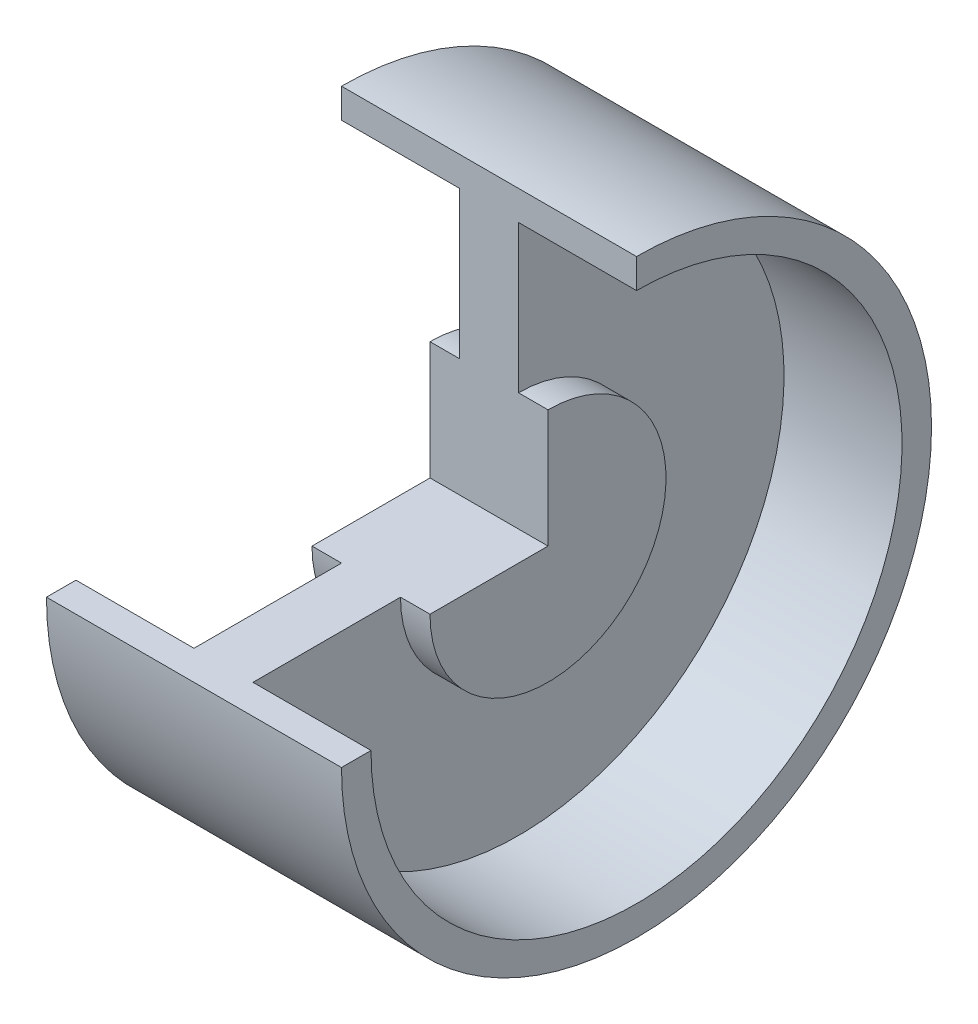
ISO-10303-21;
HEADER;
FILE_DESCRIPTION(('STEP AP214'),'2;1');
FILE_NAME('part.step','',(''),(''),'','','');
FILE_SCHEMA(('AUTOMOTIVE_DESIGN { 1 0 10303 214 1 1 1 1 }'));
ENDSEC;
DATA;
#1=APPLICATION_CONTEXT('core data for automotive mechanical design processes');
#2=APPLICATION_PROTOCOL_DEFINITION('international standard','automotive_design',2000,#1);
#3=PRODUCT_CONTEXT('',#1,'mechanical');
#4=PRODUCT('Part','Part','',(#3));
#5=PRODUCT_RELATED_PRODUCT_CATEGORY('part','',(#4));
#6=PRODUCT_DEFINITION_FORMATION('','',#4);
#7=PRODUCT_DEFINITION_CONTEXT('part definition',#1,'design');
#8=PRODUCT_DEFINITION('design','',#6,#7);
#9=PRODUCT_DEFINITION_SHAPE('','',#8);
#10=(LENGTH_UNIT() NAMED_UNIT(*) SI_UNIT(.MILLI.,.METRE.));
#11=(NAMED_UNIT(*) PLANE_ANGLE_UNIT() SI_UNIT($,.RADIAN.));
#12=(NAMED_UNIT(*) SI_UNIT($,.STERADIAN.) SOLID_ANGLE_UNIT());
#13=UNCERTAINTY_MEASURE_WITH_UNIT(LENGTH_MEASURE(1.E-05),#10,'distance_accuracy_value','');
#14=(GEOMETRIC_REPRESENTATION_CONTEXT(3) GLOBAL_UNCERTAINTY_ASSIGNED_CONTEXT((#13)) GLOBAL_UNIT_ASSIGNED_CONTEXT((#10,
#11,#12)) REPRESENTATION_CONTEXT('',''));
#15=CARTESIAN_POINT('',(0.,0.,0.));
#16=DIRECTION('',(0.,0.,1.));
#17=DIRECTION('',(1.,0.,0.));
#18=AXIS2_PLACEMENT_3D('',#15,#16,#17);
#19=CARTESIAN_POINT('',(0.,0.,0.));
#20=DIRECTION('',(0.,0.,1.));
#21=DIRECTION('',(1.,0.,0.));
#22=AXIS2_PLACEMENT_3D('',#19,#20,#21);
#23=PLANE('',#22);
#24=DIRECTION('',(1.,0.,0.));
#25=VECTOR('',#24,1.);
#26=CARTESIAN_POINT('',(0.,50.,0.));
#27=LINE('',#26,#25);
#28=CARTESIAN_POINT('',(-25.,50.,0.));
#29=VERTEX_POINT('',#28);
#30=CARTESIAN_POINT('',(25.,50.,0.));
#31=VERTEX_POINT('',#30);
#32=EDGE_CURVE('E205',#29,#31,#27,.T.);
#33=ORIENTED_EDGE('',*,*,#32,.F.);
#34=DIRECTION('',(0.,1.,0.));
#35=VECTOR('',#34,1.);
#36=CARTESIAN_POINT('',(-25.,45.,0.));
#37=LINE('',#36,#35);
#38=CARTESIAN_POINT('',(-25.,45.,0.));
#39=VERTEX_POINT('',#38);
#40=EDGE_CURVE('E162',#39,#29,#37,.T.);
#41=ORIENTED_EDGE('',*,*,#40,.F.);
#42=DIRECTION('',(-1.,0.,0.));
#43=VECTOR('',#42,1.);
#44=CARTESIAN_POINT('',(-5.,45.,0.));
#45=LINE('',#44,#43);
#46=CARTESIAN_POINT('',(-5.,45.,0.));
#47=VERTEX_POINT('',#46);
#48=EDGE_CURVE('E166',#47,#39,#45,.T.);
#49=ORIENTED_EDGE('',*,*,#48,.F.);
#50=DIRECTION('',(0.,1.,0.));
#51=VECTOR('',#50,1.);
#52=CARTESIAN_POINT('',(-5.,20.,0.));
#53=LINE('',#52,#51);
#54=CARTESIAN_POINT('',(-5.,20.,0.));
#55=VERTEX_POINT('',#54);
#56=EDGE_CURVE('E173',#55,#47,#53,.T.);
#57=ORIENTED_EDGE('',*,*,#56,.F.);
#58=DIRECTION('',(1.,0.,0.));
#59=VECTOR('',#58,1.);
#60=CARTESIAN_POINT('',(-10.,20.,0.));
#61=LINE('',#60,#59);
#62=CARTESIAN_POINT('',(-10.,20.,0.));
#63=VERTEX_POINT('',#62);
#64=EDGE_CURVE('E174',#63,#55,#61,.T.);
#65=ORIENTED_EDGE('',*,*,#64,.F.);
#66=DIRECTION('',(0.,1.,0.));
#67=VECTOR('',#66,1.);
#68=CARTESIAN_POINT('',(-10.,0.,0.));
#69=LINE('',#68,#67);
#70=CARTESIAN_POINT('',(-10.,0.,0.));
#71=VERTEX_POINT('',#70);
#72=EDGE_CURVE('E180',#71,#63,#69,.T.);
#73=ORIENTED_EDGE('',*,*,#72,.F.);
#74=DIRECTION('',(-1.,0.,0.));
#75=VECTOR('',#74,1.);
#76=CARTESIAN_POINT('',(0.,0.,0.));
#77=LINE('',#76,#75);
#78=CARTESIAN_POINT('',(10.,0.,0.));
#79=VERTEX_POINT('',#78);
#80=EDGE_CURVE('E103',#79,#71,#77,.T.);
#81=ORIENTED_EDGE('',*,*,#80,.F.);
#82=DIRECTION('',(0.,1.,0.));
#83=VECTOR('',#82,1.);
#84=CARTESIAN_POINT('',(10.,0.,0.));
#85=LINE('',#84,#83);
#86=CARTESIAN_POINT('',(10.,20.,0.));
#87=VERTEX_POINT('',#86);
#88=EDGE_CURVE('E204',#79,#87,#85,.T.);
#89=ORIENTED_EDGE('',*,*,#88,.T.);
#90=DIRECTION('',(-1.,0.,0.));
#91=VECTOR('',#90,1.);
#92=CARTESIAN_POINT('',(0.,20.,0.));
#93=LINE('',#92,#91);
#94=CARTESIAN_POINT('',(5.,20.,0.));
#95=VERTEX_POINT('',#94);
#96=EDGE_CURVE('E210',#87,#95,#93,.T.);
#97=ORIENTED_EDGE('',*,*,#96,.T.);
#98=DIRECTION('',(0.,1.,0.));
#99=VECTOR('',#98,1.);
#100=CARTESIAN_POINT('',(5.,0.,0.));
#101=LINE('',#100,#99);
#102=CARTESIAN_POINT('',(5.,45.,0.));
#103=VERTEX_POINT('',#102);
#104=EDGE_CURVE('E212',#95,#103,#101,.T.);
#105=ORIENTED_EDGE('',*,*,#104,.T.);
#106=DIRECTION('',(1.,0.,0.));
#107=VECTOR('',#106,1.);
#108=CARTESIAN_POINT('',(0.,45.,0.));
#109=LINE('',#108,#107);
#110=CARTESIAN_POINT('',(25.,45.,0.));
#111=VERTEX_POINT('',#110);
#112=EDGE_CURVE('E145',#103,#111,#109,.T.);
#113=ORIENTED_EDGE('',*,*,#112,.T.);
#114=DIRECTION('',(0.,1.,0.));
#115=VECTOR('',#114,1.);
#116=CARTESIAN_POINT('',(25.,0.,0.));
#117=LINE('',#116,#115);
#118=EDGE_CURVE('E214',#111,#31,#117,.T.);
#119=ORIENTED_EDGE('',*,*,#118,.T.);
#120=EDGE_LOOP('',(#33,#41,#49,#57,#65,#73,#81,#89,#97,#105,#113,#119));
#121=FACE_BOUND('',#120,.T.);
#122=ADVANCED_FACE('F41',(#121),#23,.T.);
#123=CARTESIAN_POINT('',(0.,0.,0.));
#124=DIRECTION('',(0.,-1.,0.));
#125=DIRECTION('',(1.,0.,0.));
#126=AXIS2_PLACEMENT_3D('',#123,#124,#125);
#127=PLANE('',#126);
#128=DIRECTION('',(1.,0.,0.));
#129=VECTOR('',#128,1.);
#130=CARTESIAN_POINT('',(0.,5.22497554027323E-13,50.));
#131=LINE('',#130,#129);
#132=CARTESIAN_POINT('',(-25.,5.22497554027323E-13,50.));
#133=VERTEX_POINT('',#132);
#134=CARTESIAN_POINT('',(25.,5.22497554027323E-13,50.));
#135=VERTEX_POINT('',#134);
#136=EDGE_CURVE('E220',#133,#135,#131,.T.);
#137=ORIENTED_EDGE('',*,*,#136,.T.);
#138=DIRECTION('',(0.,0.,1.));
#139=VECTOR('',#138,1.);
#140=CARTESIAN_POINT('',(25.,0.,0.));
#141=LINE('',#140,#139);
#142=CARTESIAN_POINT('',(25.,4.70125333944676E-13,45.));
#143=VERTEX_POINT('',#142);
#144=EDGE_CURVE('E160',#143,#135,#141,.T.);
#145=ORIENTED_EDGE('',*,*,#144,.F.);
#146=DIRECTION('',(1.,0.,0.));
#147=VECTOR('',#146,1.);
#148=CARTESIAN_POINT('',(0.,4.70125333944676E-13,45.));
#149=LINE('',#148,#147);
#150=CARTESIAN_POINT('',(5.,4.70125333944676E-13,45.));
#151=VERTEX_POINT('',#150);
#152=EDGE_CURVE('E137',#151,#143,#149,.T.);
#153=ORIENTED_EDGE('',*,*,#152,.F.);
#154=DIRECTION('',(0.,0.,1.));
#155=VECTOR('',#154,1.);
#156=CARTESIAN_POINT('',(5.,0.,0.));
#157=LINE('',#156,#155);
#158=CARTESIAN_POINT('',(5.,2.08264233531441E-13,20.));
#159=VERTEX_POINT('',#158);
#160=EDGE_CURVE('E146',#159,#151,#157,.T.);
#161=ORIENTED_EDGE('',*,*,#160,.F.);
#162=DIRECTION('',(-1.,0.,0.));
#163=VECTOR('',#162,1.);
#164=CARTESIAN_POINT('',(0.,2.08264233531441E-13,20.));
#165=LINE('',#164,#163);
#166=CARTESIAN_POINT('',(10.,2.08264233531441E-13,20.));
#167=VERTEX_POINT('',#166);
#168=EDGE_CURVE('E151',#167,#159,#165,.T.);
#169=ORIENTED_EDGE('',*,*,#168,.F.);
#170=DIRECTION('',(0.,0.,1.));
#171=VECTOR('',#170,1.);
#172=CARTESIAN_POINT('',(10.,0.,0.));
#173=LINE('',#172,#171);
#174=EDGE_CURVE('E217',#79,#167,#173,.T.);
#175=ORIENTED_EDGE('',*,*,#174,.F.);
#176=ORIENTED_EDGE('',*,*,#80,.T.);
#177=DIRECTION('',(0.,0.,1.));
#178=VECTOR('',#177,1.);
#179=CARTESIAN_POINT('',(-10.,0.,0.));
#180=LINE('',#179,#178);
#181=CARTESIAN_POINT('',(-10.,2.08264233531441E-13,20.));
#182=VERTEX_POINT('',#181);
#183=EDGE_CURVE('E192',#71,#182,#180,.T.);
#184=ORIENTED_EDGE('',*,*,#183,.T.);
#185=DIRECTION('',(1.,0.,0.));
#186=VECTOR('',#185,1.);
#187=CARTESIAN_POINT('',(-10.,2.08264233531441E-13,20.));
#188=LINE('',#187,#186);
#189=CARTESIAN_POINT('',(-5.,2.08264233531441E-13,20.));
#190=VERTEX_POINT('',#189);
#191=EDGE_CURVE('E187',#182,#190,#188,.T.);
#192=ORIENTED_EDGE('',*,*,#191,.T.);
#193=DIRECTION('',(0.,0.,1.));
#194=VECTOR('',#193,1.);
#195=CARTESIAN_POINT('',(-5.,2.08264233531441E-13,20.));
#196=LINE('',#195,#194);
#197=CARTESIAN_POINT('',(-5.,4.70125333944676E-13,45.));
#198=VERTEX_POINT('',#197);
#199=EDGE_CURVE('E184',#190,#198,#196,.T.);
#200=ORIENTED_EDGE('',*,*,#199,.T.);
#201=DIRECTION('',(-1.,0.,0.));
#202=VECTOR('',#201,1.);
#203=CARTESIAN_POINT('',(-5.,4.70125333944676E-13,45.));
#204=LINE('',#203,#202);
#205=CARTESIAN_POINT('',(-25.,4.70125333944676E-13,45.));
#206=VERTEX_POINT('',#205);
#207=EDGE_CURVE('E185',#198,#206,#204,.T.);
#208=ORIENTED_EDGE('',*,*,#207,.T.);
#209=DIRECTION('',(0.,0.,1.));
#210=VECTOR('',#209,1.);
#211=CARTESIAN_POINT('',(-25.,4.70125333944676E-13,45.));
#212=LINE('',#211,#210);
#213=EDGE_CURVE('E177',#206,#133,#212,.T.);
#214=ORIENTED_EDGE('',*,*,#213,.T.);
#215=EDGE_LOOP('',(#137,#145,#153,#161,#169,#175,#176,#184,#192,#200,#208,#214));
#216=FACE_BOUND('',#215,.T.);
#217=ADVANCED_FACE('F152',(#216),#127,.F.);
#218=CARTESIAN_POINT('',(10.,0.,0.));
#219=DIRECTION('',(1.,0.,0.));
#220=DIRECTION('',(0.,0.,-1.));
#221=AXIS2_PLACEMENT_3D('',#218,#219,#220);
#222=CYLINDRICAL_SURFACE('',#221,50.);
#223=ORIENTED_EDGE('',*,*,#136,.F.);
#224=CARTESIAN_POINT('',(-25.,0.,0.));
#225=DIRECTION('',(1.,0.,0.));
#226=DIRECTION('',(0.,0.,-1.));
#227=AXIS2_PLACEMENT_3D('',#224,#225,#226);
#228=CIRCLE('',#227,50.);
#229=EDGE_CURVE('E44',#133,#29,#228,.T.);
#230=ORIENTED_EDGE('',*,*,#229,.T.);
#231=ORIENTED_EDGE('',*,*,#32,.T.);
#232=CARTESIAN_POINT('',(25.,0.,0.));
#233=DIRECTION('',(1.,0.,0.));
#234=DIRECTION('',(0.,0.,-1.));
#235=AXIS2_PLACEMENT_3D('',#232,#233,#234);
#236=CIRCLE('',#235,50.);
#237=EDGE_CURVE('E58',#135,#31,#236,.T.);
#238=ORIENTED_EDGE('',*,*,#237,.F.);
#239=EDGE_LOOP('',(#223,#230,#231,#238));
#240=FACE_BOUND('',#239,.T.);
#241=ADVANCED_FACE('F245',(#240),#222,.T.);
#242=CARTESIAN_POINT('',(25.,0.,0.));
#243=DIRECTION('',(1.,0.,0.));
#244=DIRECTION('',(0.,0.,-1.));
#245=AXIS2_PLACEMENT_3D('',#242,#243,#244);
#246=PLANE('',#245);
#247=ORIENTED_EDGE('',*,*,#144,.T.);
#248=ORIENTED_EDGE('',*,*,#237,.T.);
#249=ORIENTED_EDGE('',*,*,#118,.F.);
#250=CARTESIAN_POINT('',(25.,0.,0.));
#251=DIRECTION('',(1.,0.,0.));
#252=DIRECTION('',(0.,0.,-1.));
#253=AXIS2_PLACEMENT_3D('',#250,#251,#252);
#254=CIRCLE('',#253,45.);
#255=EDGE_CURVE('E147',#143,#111,#254,.T.);
#256=ORIENTED_EDGE('',*,*,#255,.F.);
#257=EDGE_LOOP('',(#247,#248,#249,#256));
#258=FACE_BOUND('',#257,.T.);
#259=ADVANCED_FACE('F238',(#258),#246,.T.);
#260=CARTESIAN_POINT('',(10.,0.,0.));
#261=DIRECTION('',(1.,0.,0.));
#262=DIRECTION('',(0.,0.,-1.));
#263=AXIS2_PLACEMENT_3D('',#260,#261,#262);
#264=CYLINDRICAL_SURFACE('',#263,45.);
#265=ORIENTED_EDGE('',*,*,#255,.T.);
#266=ORIENTED_EDGE('',*,*,#112,.F.);
#267=CARTESIAN_POINT('',(5.,0.,0.));
#268=DIRECTION('',(1.,0.,0.));
#269=DIRECTION('',(0.,0.,-1.));
#270=AXIS2_PLACEMENT_3D('',#267,#268,#269);
#271=CIRCLE('',#270,45.);
#272=EDGE_CURVE('E134',#151,#103,#271,.T.);
#273=ORIENTED_EDGE('',*,*,#272,.F.);
#274=ORIENTED_EDGE('',*,*,#152,.T.);
#275=EDGE_LOOP('',(#265,#266,#273,#274));
#276=FACE_BOUND('',#275,.T.);
#277=ADVANCED_FACE('F140',(#276),#264,.F.);
#278=CARTESIAN_POINT('',(5.,0.,0.));
#279=DIRECTION('',(1.,0.,0.));
#280=DIRECTION('',(0.,0.,-1.));
#281=AXIS2_PLACEMENT_3D('',#278,#279,#280);
#282=PLANE('',#281);
#283=ORIENTED_EDGE('',*,*,#272,.T.);
#284=ORIENTED_EDGE('',*,*,#104,.F.);
#285=CARTESIAN_POINT('',(5.,0.,0.));
#286=DIRECTION('',(1.,0.,0.));
#287=DIRECTION('',(0.,0.,-1.));
#288=AXIS2_PLACEMENT_3D('',#285,#286,#287);
#289=CIRCLE('',#288,20.);
#290=EDGE_CURVE('E51',#159,#95,#289,.T.);
#291=ORIENTED_EDGE('',*,*,#290,.F.);
#292=ORIENTED_EDGE('',*,*,#160,.T.);
#293=EDGE_LOOP('',(#283,#284,#291,#292));
#294=FACE_BOUND('',#293,.T.);
#295=ADVANCED_FACE('F148',(#294),#282,.T.);
#296=CARTESIAN_POINT('',(10.,0.,0.));
#297=DIRECTION('',(1.,0.,0.));
#298=DIRECTION('',(0.,0.,-1.));
#299=AXIS2_PLACEMENT_3D('',#296,#297,#298);
#300=CYLINDRICAL_SURFACE('',#299,20.);
#301=ORIENTED_EDGE('',*,*,#290,.T.);
#302=ORIENTED_EDGE('',*,*,#96,.F.);
#303=CARTESIAN_POINT('',(10.,0.,0.));
#304=DIRECTION('',(1.,0.,0.));
#305=DIRECTION('',(0.,0.,-1.));
#306=AXIS2_PLACEMENT_3D('',#303,#304,#305);
#307=CIRCLE('',#306,20.);
#308=EDGE_CURVE('E11',#167,#87,#307,.T.);
#309=ORIENTED_EDGE('',*,*,#308,.F.);
#310=ORIENTED_EDGE('',*,*,#168,.T.);
#311=EDGE_LOOP('',(#301,#302,#309,#310));
#312=FACE_BOUND('',#311,.T.);
#313=ADVANCED_FACE('F225',(#312),#300,.T.);
#314=CARTESIAN_POINT('',(10.,0.,0.));
#315=DIRECTION('',(1.,0.,0.));
#316=DIRECTION('',(0.,0.,-1.));
#317=AXIS2_PLACEMENT_3D('',#314,#315,#316);
#318=PLANE('',#317);
#319=ORIENTED_EDGE('',*,*,#308,.T.);
#320=ORIENTED_EDGE('',*,*,#88,.F.);
#321=ORIENTED_EDGE('',*,*,#174,.T.);
#322=EDGE_LOOP('',(#319,#320,#321));
#323=FACE_BOUND('',#322,.T.);
#324=ADVANCED_FACE('F222',(#323),#318,.T.);
#325=CARTESIAN_POINT('',(-10.,0.,0.));
#326=DIRECTION('',(1.,0.,0.));
#327=DIRECTION('',(0.,0.,-1.));
#328=AXIS2_PLACEMENT_3D('',#325,#326,#327);
#329=PLANE('',#328);
#330=ORIENTED_EDGE('',*,*,#72,.T.);
#331=CARTESIAN_POINT('',(-10.,0.,0.));
#332=DIRECTION('',(1.,0.,0.));
#333=DIRECTION('',(0.,0.,-1.));
#334=AXIS2_PLACEMENT_3D('',#331,#332,#333);
#335=CIRCLE('',#334,20.);
#336=EDGE_CURVE('E100',#182,#63,#335,.T.);
#337=ORIENTED_EDGE('',*,*,#336,.F.);
#338=ORIENTED_EDGE('',*,*,#183,.F.);
#339=EDGE_LOOP('',(#330,#337,#338));
#340=FACE_BOUND('',#339,.T.);
#341=ADVANCED_FACE('F228',(#340),#329,.F.);
#342=CARTESIAN_POINT('',(10.,0.,0.));
#343=DIRECTION('',(1.,0.,0.));
#344=DIRECTION('',(0.,0.,-1.));
#345=AXIS2_PLACEMENT_3D('',#342,#343,#344);
#346=CYLINDRICAL_SURFACE('',#345,20.);
#347=ORIENTED_EDGE('',*,*,#336,.T.);
#348=ORIENTED_EDGE('',*,*,#64,.T.);
#349=CARTESIAN_POINT('',(-5.,0.,0.));
#350=DIRECTION('',(1.,0.,0.));
#351=DIRECTION('',(0.,0.,-1.));
#352=AXIS2_PLACEMENT_3D('',#349,#350,#351);
#353=CIRCLE('',#352,20.);
#354=EDGE_CURVE('E191',#190,#55,#353,.T.);
#355=ORIENTED_EDGE('',*,*,#354,.F.);
#356=ORIENTED_EDGE('',*,*,#191,.F.);
#357=EDGE_LOOP('',(#347,#348,#355,#356));
#358=FACE_BOUND('',#357,.T.);
#359=ADVANCED_FACE('F231',(#358),#346,.T.);
#360=CARTESIAN_POINT('',(-5.,2.08264233531441E-13,20.));
#361=DIRECTION('',(1.,0.,0.));
#362=DIRECTION('',(0.,0.,-1.));
#363=AXIS2_PLACEMENT_3D('',#360,#361,#362);
#364=PLANE('',#363);
#365=ORIENTED_EDGE('',*,*,#354,.T.);
#366=ORIENTED_EDGE('',*,*,#56,.T.);
#367=CARTESIAN_POINT('',(-5.,0.,0.));
#368=DIRECTION('',(1.,0.,0.));
#369=DIRECTION('',(0.,0.,-1.));
#370=AXIS2_PLACEMENT_3D('',#367,#368,#369);
#371=CIRCLE('',#370,45.);
#372=EDGE_CURVE('E198',#198,#47,#371,.T.);
#373=ORIENTED_EDGE('',*,*,#372,.F.);
#374=ORIENTED_EDGE('',*,*,#199,.F.);
#375=EDGE_LOOP('',(#365,#366,#373,#374));
#376=FACE_BOUND('',#375,.T.);
#377=ADVANCED_FACE('F232',(#376),#364,.F.);
#378=CARTESIAN_POINT('',(10.,0.,0.));
#379=DIRECTION('',(1.,0.,0.));
#380=DIRECTION('',(0.,0.,-1.));
#381=AXIS2_PLACEMENT_3D('',#378,#379,#380);
#382=CYLINDRICAL_SURFACE('',#381,45.);
#383=ORIENTED_EDGE('',*,*,#372,.T.);
#384=ORIENTED_EDGE('',*,*,#48,.T.);
#385=CARTESIAN_POINT('',(-25.,0.,0.));
#386=DIRECTION('',(1.,0.,0.));
#387=DIRECTION('',(0.,0.,-1.));
#388=AXIS2_PLACEMENT_3D('',#385,#386,#387);
#389=CIRCLE('',#388,45.);
#390=EDGE_CURVE('E200',#206,#39,#389,.T.);
#391=ORIENTED_EDGE('',*,*,#390,.F.);
#392=ORIENTED_EDGE('',*,*,#207,.F.);
#393=EDGE_LOOP('',(#383,#384,#391,#392));
#394=FACE_BOUND('',#393,.T.);
#395=ADVANCED_FACE('F240',(#394),#382,.F.);
#396=CARTESIAN_POINT('',(-25.,4.70125333944676E-13,45.));
#397=DIRECTION('',(1.,0.,0.));
#398=DIRECTION('',(0.,0.,-1.));
#399=AXIS2_PLACEMENT_3D('',#396,#397,#398);
#400=PLANE('',#399);
#401=ORIENTED_EDGE('',*,*,#390,.T.);
#402=ORIENTED_EDGE('',*,*,#40,.T.);
#403=ORIENTED_EDGE('',*,*,#229,.F.);
#404=ORIENTED_EDGE('',*,*,#213,.F.);
#405=EDGE_LOOP('',(#401,#402,#403,#404));
#406=FACE_BOUND('',#405,.T.);
#407=ADVANCED_FACE('F43',(#406),#400,.F.);
#408=CLOSED_SHELL('',(#122,#217,#241,#259,#277,#295,#313,#324,#341,#359,#377,#395,#407));
#409=MANIFOLD_SOLID_BREP('B2',#408);
#410=ADVANCED_BREP_SHAPE_REPRESENTATION('',(#18,#409),#14);
#411=SHAPE_DEFINITION_REPRESENTATION(#9,#410);
ENDSEC;
END-ISO-10303-21;
